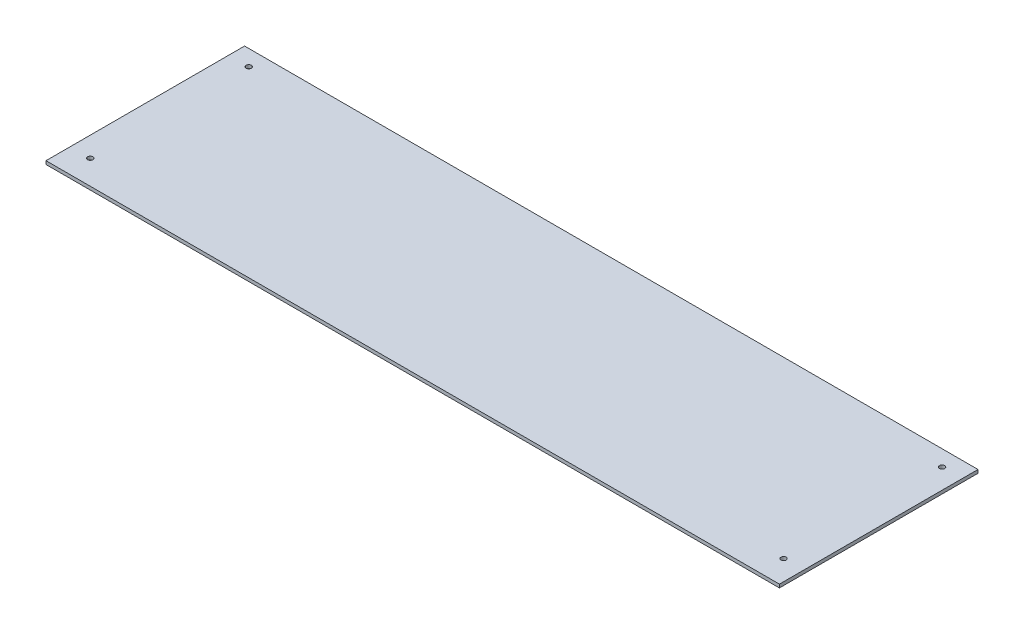
ISO-10303-21;
HEADER;
FILE_DESCRIPTION(('STEP AP214'),'2;1');
FILE_NAME('part.step','',(''),(''),'','','');
FILE_SCHEMA(('AUTOMOTIVE_DESIGN { 1 0 10303 214 1 1 1 1 }'));
ENDSEC;
DATA;
#1=APPLICATION_CONTEXT('core data for automotive mechanical design processes');
#2=APPLICATION_PROTOCOL_DEFINITION('international standard','automotive_design',2000,#1);
#3=PRODUCT_CONTEXT('',#1,'mechanical');
#4=PRODUCT('Part','Part','',(#3));
#5=PRODUCT_RELATED_PRODUCT_CATEGORY('part','',(#4));
#6=PRODUCT_DEFINITION_FORMATION('','',#4);
#7=PRODUCT_DEFINITION_CONTEXT('part definition',#1,'design');
#8=PRODUCT_DEFINITION('design','',#6,#7);
#9=PRODUCT_DEFINITION_SHAPE('','',#8);
#10=(LENGTH_UNIT() NAMED_UNIT(*) SI_UNIT(.MILLI.,.METRE.));
#11=(NAMED_UNIT(*) PLANE_ANGLE_UNIT() SI_UNIT($,.RADIAN.));
#12=(NAMED_UNIT(*) SI_UNIT($,.STERADIAN.) SOLID_ANGLE_UNIT());
#13=UNCERTAINTY_MEASURE_WITH_UNIT(LENGTH_MEASURE(1.E-05),#10,'distance_accuracy_value','');
#14=(GEOMETRIC_REPRESENTATION_CONTEXT(3) GLOBAL_UNCERTAINTY_ASSIGNED_CONTEXT((#13)) GLOBAL_UNIT_ASSIGNED_CONTEXT((#10,
#11,#12)) REPRESENTATION_CONTEXT('',''));
#15=CARTESIAN_POINT('',(0.,0.,0.));
#16=DIRECTION('',(0.,0.,1.));
#17=DIRECTION('',(1.,0.,0.));
#18=AXIS2_PLACEMENT_3D('',#15,#16,#17);
#19=CARTESIAN_POINT('',(0.,2.,0.));
#20=DIRECTION('',(0.,-1.,0.));
#21=DIRECTION('',(0.,0.,-1.));
#22=AXIS2_PLACEMENT_3D('',#19,#20,#21);
#23=PLANE('',#22);
#24=CARTESIAN_POINT('',(428.,2.,-110.));
#25=DIRECTION('',(0.,1.,0.));
#26=DIRECTION('',(0.,0.,-1.));
#27=AXIS2_PLACEMENT_3D('',#24,#25,#26);
#28=CIRCLE('',#27,1.54999999999999);
#29=CARTESIAN_POINT('',(428.,2.,-111.55));
#30=VERTEX_POINT('',#29);
#31=EDGE_CURVE('E109',#30,#30,#28,.T.);
#32=ORIENTED_EDGE('',*,*,#31,.F.);
#33=EDGE_LOOP('',(#32));
#34=FACE_BOUND('',#33,.T.);
#35=CARTESIAN_POINT('',(428.,2.,-15.));
#36=DIRECTION('',(0.,1.,0.));
#37=DIRECTION('',(0.,0.,-1.));
#38=AXIS2_PLACEMENT_3D('',#35,#36,#37);
#39=CIRCLE('',#38,1.54999999999999);
#40=CARTESIAN_POINT('',(428.,2.,-16.55));
#41=VERTEX_POINT('',#40);
#42=EDGE_CURVE('E117',#41,#41,#39,.T.);
#43=ORIENTED_EDGE('',*,*,#42,.F.);
#44=EDGE_LOOP('',(#43));
#45=FACE_BOUND('',#44,.T.);
#46=CARTESIAN_POINT('',(12.5,2.,-110.));
#47=DIRECTION('',(0.,1.,0.));
#48=DIRECTION('',(0.,0.,1.));
#49=AXIS2_PLACEMENT_3D('',#46,#47,#48);
#50=CIRCLE('',#49,1.54999999999999);
#51=CARTESIAN_POINT('',(12.5,2.,-108.45));
#52=VERTEX_POINT('',#51);
#53=EDGE_CURVE('E123',#52,#52,#50,.T.);
#54=ORIENTED_EDGE('',*,*,#53,.F.);
#55=EDGE_LOOP('',(#54));
#56=FACE_BOUND('',#55,.T.);
#57=CARTESIAN_POINT('',(12.5,2.,-15.));
#58=DIRECTION('',(0.,1.,0.));
#59=DIRECTION('',(0.,0.,1.));
#60=AXIS2_PLACEMENT_3D('',#57,#58,#59);
#61=CIRCLE('',#60,1.55);
#62=CARTESIAN_POINT('',(12.5,2.,-13.45));
#63=VERTEX_POINT('',#62);
#64=EDGE_CURVE('E11',#63,#63,#61,.T.);
#65=ORIENTED_EDGE('',*,*,#64,.F.);
#66=EDGE_LOOP('',(#65));
#67=FACE_BOUND('',#66,.T.);
#68=DIRECTION('',(1.,0.,0.));
#69=VECTOR('',#68,1.);
#70=CARTESIAN_POINT('',(440.,2.,-0.499999999999996));
#71=LINE('',#70,#69);
#72=CARTESIAN_POINT('',(0.5,2.,-0.5));
#73=VERTEX_POINT('',#72);
#74=CARTESIAN_POINT('',(440.,2.,-0.499999999999996));
#75=VERTEX_POINT('',#74);
#76=EDGE_CURVE('E81',#73,#75,#71,.T.);
#77=ORIENTED_EDGE('',*,*,#76,.T.);
#78=DIRECTION('',(0.,0.,-1.));
#79=VECTOR('',#78,1.);
#80=CARTESIAN_POINT('',(440.,2.,-119.5));
#81=LINE('',#80,#79);
#82=CARTESIAN_POINT('',(440.,2.,-119.5));
#83=VERTEX_POINT('',#82);
#84=EDGE_CURVE('E108',#75,#83,#81,.T.);
#85=ORIENTED_EDGE('',*,*,#84,.T.);
#86=DIRECTION('',(-1.,0.,0.));
#87=VECTOR('',#86,1.);
#88=CARTESIAN_POINT('',(0.5,2.,-119.5));
#89=LINE('',#88,#87);
#90=CARTESIAN_POINT('',(0.5,2.,-119.5));
#91=VERTEX_POINT('',#90);
#92=EDGE_CURVE('E162',#83,#91,#89,.T.);
#93=ORIENTED_EDGE('',*,*,#92,.T.);
#94=DIRECTION('',(0.,0.,1.));
#95=VECTOR('',#94,1.);
#96=CARTESIAN_POINT('',(0.5,2.,-0.5));
#97=LINE('',#96,#95);
#98=EDGE_CURVE('E116',#91,#73,#97,.T.);
#99=ORIENTED_EDGE('',*,*,#98,.T.);
#100=EDGE_LOOP('',(#77,#85,#93,#99));
#101=FACE_BOUND('',#100,.T.);
#102=ADVANCED_FACE('F37',(#34,#45,#56,#67,#101),#23,.F.);
#103=CARTESIAN_POINT('',(0.,0.,0.));
#104=DIRECTION('',(0.,-1.,0.));
#105=DIRECTION('',(0.,0.,-1.));
#106=AXIS2_PLACEMENT_3D('',#103,#104,#105);
#107=PLANE('',#106);
#108=CARTESIAN_POINT('',(428.,0.,-110.));
#109=DIRECTION('',(0.,1.,0.));
#110=DIRECTION('',(0.,0.,-1.));
#111=AXIS2_PLACEMENT_3D('',#108,#109,#110);
#112=CIRCLE('',#111,1.54999999999999);
#113=CARTESIAN_POINT('',(428.,0.,-111.55));
#114=VERTEX_POINT('',#113);
#115=EDGE_CURVE('E113',#114,#114,#112,.T.);
#116=ORIENTED_EDGE('',*,*,#115,.T.);
#117=EDGE_LOOP('',(#116));
#118=FACE_BOUND('',#117,.T.);
#119=CARTESIAN_POINT('',(12.5,0.,-110.));
#120=DIRECTION('',(0.,1.,0.));
#121=DIRECTION('',(0.,0.,1.));
#122=AXIS2_PLACEMENT_3D('',#119,#120,#121);
#123=CIRCLE('',#122,1.54999999999999);
#124=CARTESIAN_POINT('',(12.5,0.,-108.45));
#125=VERTEX_POINT('',#124);
#126=EDGE_CURVE('E120',#125,#125,#123,.T.);
#127=ORIENTED_EDGE('',*,*,#126,.T.);
#128=EDGE_LOOP('',(#127));
#129=FACE_BOUND('',#128,.T.);
#130=CARTESIAN_POINT('',(12.5,0.,-15.));
#131=DIRECTION('',(0.,1.,0.));
#132=DIRECTION('',(0.,0.,1.));
#133=AXIS2_PLACEMENT_3D('',#130,#131,#132);
#134=CIRCLE('',#133,1.55);
#135=CARTESIAN_POINT('',(12.5,0.,-13.45));
#136=VERTEX_POINT('',#135);
#137=EDGE_CURVE('E41',#136,#136,#134,.T.);
#138=ORIENTED_EDGE('',*,*,#137,.T.);
#139=EDGE_LOOP('',(#138));
#140=FACE_BOUND('',#139,.T.);
#141=CARTESIAN_POINT('',(428.,0.,-15.));
#142=DIRECTION('',(0.,1.,0.));
#143=DIRECTION('',(0.,0.,-1.));
#144=AXIS2_PLACEMENT_3D('',#141,#142,#143);
#145=CIRCLE('',#144,1.54999999999999);
#146=CARTESIAN_POINT('',(428.,0.,-16.55));
#147=VERTEX_POINT('',#146);
#148=EDGE_CURVE('E112',#147,#147,#145,.T.);
#149=ORIENTED_EDGE('',*,*,#148,.T.);
#150=EDGE_LOOP('',(#149));
#151=FACE_BOUND('',#150,.T.);
#152=DIRECTION('',(0.,0.,1.));
#153=VECTOR('',#152,1.);
#154=CARTESIAN_POINT('',(440.,0.,-119.5));
#155=LINE('',#154,#153);
#156=CARTESIAN_POINT('',(440.,0.,-119.5));
#157=VERTEX_POINT('',#156);
#158=CARTESIAN_POINT('',(440.,0.,-0.499999999999996));
#159=VERTEX_POINT('',#158);
#160=EDGE_CURVE('E97',#157,#159,#155,.T.);
#161=ORIENTED_EDGE('',*,*,#160,.T.);
#162=DIRECTION('',(-1.,0.,0.));
#163=VECTOR('',#162,1.);
#164=CARTESIAN_POINT('',(440.,0.,-0.499999999999996));
#165=LINE('',#164,#163);
#166=CARTESIAN_POINT('',(0.5,0.,-0.5));
#167=VERTEX_POINT('',#166);
#168=EDGE_CURVE('E60',#159,#167,#165,.T.);
#169=ORIENTED_EDGE('',*,*,#168,.T.);
#170=DIRECTION('',(0.,0.,-1.));
#171=VECTOR('',#170,1.);
#172=CARTESIAN_POINT('',(0.5,0.,-0.5));
#173=LINE('',#172,#171);
#174=CARTESIAN_POINT('',(0.5,0.,-119.5));
#175=VERTEX_POINT('',#174);
#176=EDGE_CURVE('E88',#167,#175,#173,.T.);
#177=ORIENTED_EDGE('',*,*,#176,.T.);
#178=DIRECTION('',(1.,0.,0.));
#179=VECTOR('',#178,1.);
#180=CARTESIAN_POINT('',(0.5,0.,-119.5));
#181=LINE('',#180,#179);
#182=EDGE_CURVE('E94',#175,#157,#181,.T.);
#183=ORIENTED_EDGE('',*,*,#182,.T.);
#184=EDGE_LOOP('',(#161,#169,#177,#183));
#185=FACE_BOUND('',#184,.T.);
#186=ADVANCED_FACE('F39',(#118,#129,#140,#151,#185),#107,.T.);
#187=CARTESIAN_POINT('',(12.5,2.,-15.));
#188=DIRECTION('',(0.,-1.,0.));
#189=DIRECTION('',(0.,0.,-1.));
#190=AXIS2_PLACEMENT_3D('',#187,#188,#189);
#191=CYLINDRICAL_SURFACE('',#190,1.55);
#192=ORIENTED_EDGE('',*,*,#64,.T.);
#193=EDGE_LOOP('',(#192));
#194=FACE_BOUND('',#193,.T.);
#195=ORIENTED_EDGE('',*,*,#137,.F.);
#196=EDGE_LOOP('',(#195));
#197=FACE_BOUND('',#196,.T.);
#198=ADVANCED_FACE('F134',(#194,#197),#191,.F.);
#199=CARTESIAN_POINT('',(12.5,2.,-110.));
#200=DIRECTION('',(0.,-1.,0.));
#201=DIRECTION('',(0.,0.,-1.));
#202=AXIS2_PLACEMENT_3D('',#199,#200,#201);
#203=CYLINDRICAL_SURFACE('',#202,1.54999999999999);
#204=ORIENTED_EDGE('',*,*,#53,.T.);
#205=EDGE_LOOP('',(#204));
#206=FACE_BOUND('',#205,.T.);
#207=ORIENTED_EDGE('',*,*,#126,.F.);
#208=EDGE_LOOP('',(#207));
#209=FACE_BOUND('',#208,.T.);
#210=ADVANCED_FACE('F131',(#206,#209),#203,.F.);
#211=CARTESIAN_POINT('',(428.,2.,-15.));
#212=DIRECTION('',(0.,-1.,0.));
#213=DIRECTION('',(0.,0.,-1.));
#214=AXIS2_PLACEMENT_3D('',#211,#212,#213);
#215=CYLINDRICAL_SURFACE('',#214,1.54999999999999);
#216=ORIENTED_EDGE('',*,*,#42,.T.);
#217=EDGE_LOOP('',(#216));
#218=FACE_BOUND('',#217,.T.);
#219=ORIENTED_EDGE('',*,*,#148,.F.);
#220=EDGE_LOOP('',(#219));
#221=FACE_BOUND('',#220,.T.);
#222=ADVANCED_FACE('F133',(#218,#221),#215,.F.);
#223=CARTESIAN_POINT('',(428.,2.,-110.));
#224=DIRECTION('',(0.,-1.,0.));
#225=DIRECTION('',(0.,0.,-1.));
#226=AXIS2_PLACEMENT_3D('',#223,#224,#225);
#227=CYLINDRICAL_SURFACE('',#226,1.54999999999999);
#228=ORIENTED_EDGE('',*,*,#31,.T.);
#229=EDGE_LOOP('',(#228));
#230=FACE_BOUND('',#229,.T.);
#231=ORIENTED_EDGE('',*,*,#115,.F.);
#232=EDGE_LOOP('',(#231));
#233=FACE_BOUND('',#232,.T.);
#234=ADVANCED_FACE('F141',(#230,#233),#227,.F.);
#235=CARTESIAN_POINT('',(440.,458.552570905038,-0.499999999999996));
#236=DIRECTION('',(0.,0.,1.));
#237=DIRECTION('',(1.,0.,0.));
#238=AXIS2_PLACEMENT_3D('',#235,#236,#237);
#239=PLANE('',#238);
#240=DIRECTION('',(0.,-1.,0.));
#241=VECTOR('',#240,1.);
#242=CARTESIAN_POINT('',(0.5,458.552570905038,-0.5));
#243=LINE('',#242,#241);
#244=EDGE_CURVE('E77',#73,#167,#243,.T.);
#245=ORIENTED_EDGE('',*,*,#244,.T.);
#246=ORIENTED_EDGE('',*,*,#168,.F.);
#247=DIRECTION('',(0.,-1.,0.));
#248=VECTOR('',#247,1.);
#249=CARTESIAN_POINT('',(440.,458.552570905038,-0.499999999999996));
#250=LINE('',#249,#248);
#251=EDGE_CURVE('E85',#75,#159,#250,.T.);
#252=ORIENTED_EDGE('',*,*,#251,.F.);
#253=ORIENTED_EDGE('',*,*,#76,.F.);
#254=EDGE_LOOP('',(#245,#246,#252,#253));
#255=FACE_BOUND('',#254,.T.);
#256=ADVANCED_FACE('F79',(#255),#239,.T.);
#257=CARTESIAN_POINT('',(0.5,458.552570905038,-0.5));
#258=DIRECTION('',(-1.,0.,0.));
#259=DIRECTION('',(0.,0.,1.));
#260=AXIS2_PLACEMENT_3D('',#257,#258,#259);
#261=PLANE('',#260);
#262=DIRECTION('',(0.,-1.,0.));
#263=VECTOR('',#262,1.);
#264=CARTESIAN_POINT('',(0.5,458.552570905038,-119.5));
#265=LINE('',#264,#263);
#266=EDGE_CURVE('E84',#91,#175,#265,.T.);
#267=ORIENTED_EDGE('',*,*,#266,.T.);
#268=ORIENTED_EDGE('',*,*,#176,.F.);
#269=ORIENTED_EDGE('',*,*,#244,.F.);
#270=ORIENTED_EDGE('',*,*,#98,.F.);
#271=EDGE_LOOP('',(#267,#268,#269,#270));
#272=FACE_BOUND('',#271,.T.);
#273=ADVANCED_FACE('F89',(#272),#261,.T.);
#274=CARTESIAN_POINT('',(0.5,458.552570905038,-119.5));
#275=DIRECTION('',(0.,0.,-1.));
#276=DIRECTION('',(-1.,0.,0.));
#277=AXIS2_PLACEMENT_3D('',#274,#275,#276);
#278=PLANE('',#277);
#279=DIRECTION('',(0.,-1.,0.));
#280=VECTOR('',#279,1.);
#281=CARTESIAN_POINT('',(440.,458.552570905038,-119.5));
#282=LINE('',#281,#280);
#283=EDGE_CURVE('E52',#83,#157,#282,.T.);
#284=ORIENTED_EDGE('',*,*,#283,.T.);
#285=ORIENTED_EDGE('',*,*,#182,.F.);
#286=ORIENTED_EDGE('',*,*,#266,.F.);
#287=ORIENTED_EDGE('',*,*,#92,.F.);
#288=EDGE_LOOP('',(#284,#285,#286,#287));
#289=FACE_BOUND('',#288,.T.);
#290=ADVANCED_FACE('F167',(#289),#278,.T.);
#291=CARTESIAN_POINT('',(440.,458.552570905038,-119.5));
#292=DIRECTION('',(1.,0.,0.));
#293=DIRECTION('',(0.,0.,-1.));
#294=AXIS2_PLACEMENT_3D('',#291,#292,#293);
#295=PLANE('',#294);
#296=ORIENTED_EDGE('',*,*,#251,.T.);
#297=ORIENTED_EDGE('',*,*,#160,.F.);
#298=ORIENTED_EDGE('',*,*,#283,.F.);
#299=ORIENTED_EDGE('',*,*,#84,.F.);
#300=EDGE_LOOP('',(#296,#297,#298,#299));
#301=FACE_BOUND('',#300,.T.);
#302=ADVANCED_FACE('F168',(#301),#295,.T.);
#303=CLOSED_SHELL('',(#102,#186,#198,#210,#222,#234,#256,#273,#290,#302));
#304=MANIFOLD_SOLID_BREP('B2',#303);
#305=ADVANCED_BREP_SHAPE_REPRESENTATION('',(#18,#304),#14);
#306=SHAPE_DEFINITION_REPRESENTATION(#9,#305);
ENDSEC;
END-ISO-10303-21;
